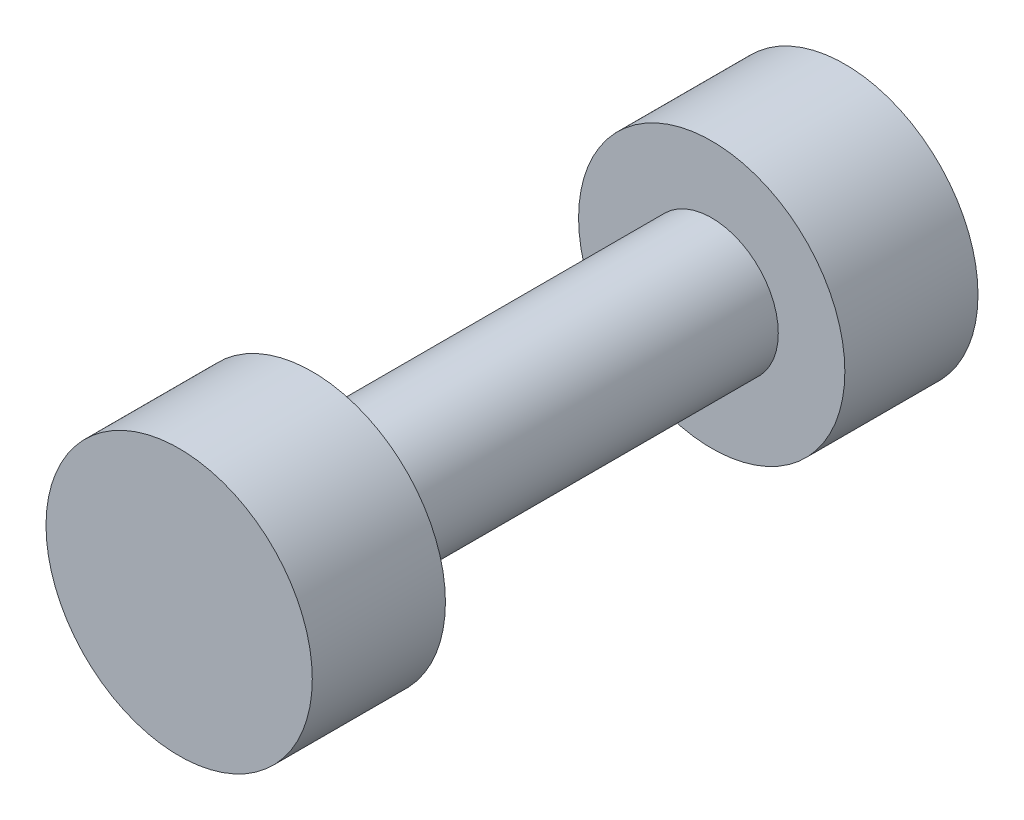
ISO-10303-21;
HEADER;
FILE_DESCRIPTION(('STEP AP214'),'2;1');
FILE_NAME('part.step','',(''),(''),'','','');
FILE_SCHEMA(('AUTOMOTIVE_DESIGN { 1 0 10303 214 1 1 1 1 }'));
ENDSEC;
DATA;
#1=APPLICATION_CONTEXT('core data for automotive mechanical design processes');
#2=APPLICATION_PROTOCOL_DEFINITION('international standard','automotive_design',2000,#1);
#3=PRODUCT_CONTEXT('',#1,'mechanical');
#4=PRODUCT('Part','Part','',(#3));
#5=PRODUCT_RELATED_PRODUCT_CATEGORY('part','',(#4));
#6=PRODUCT_DEFINITION_FORMATION('','',#4);
#7=PRODUCT_DEFINITION_CONTEXT('part definition',#1,'design');
#8=PRODUCT_DEFINITION('design','',#6,#7);
#9=PRODUCT_DEFINITION_SHAPE('','',#8);
#10=(LENGTH_UNIT() NAMED_UNIT(*) SI_UNIT(.MILLI.,.METRE.));
#11=(NAMED_UNIT(*) PLANE_ANGLE_UNIT() SI_UNIT($,.RADIAN.));
#12=(NAMED_UNIT(*) SI_UNIT($,.STERADIAN.) SOLID_ANGLE_UNIT());
#13=UNCERTAINTY_MEASURE_WITH_UNIT(LENGTH_MEASURE(1.E-05),#10,'distance_accuracy_value','');
#14=(GEOMETRIC_REPRESENTATION_CONTEXT(3) GLOBAL_UNCERTAINTY_ASSIGNED_CONTEXT((#13)) GLOBAL_UNIT_ASSIGNED_CONTEXT((#10,
#11,#12)) REPRESENTATION_CONTEXT('',''));
#15=CARTESIAN_POINT('',(0.,0.,0.));
#16=DIRECTION('',(0.,0.,1.));
#17=DIRECTION('',(1.,0.,0.));
#18=AXIS2_PLACEMENT_3D('',#15,#16,#17);
#19=CARTESIAN_POINT('',(0.,0.,1.5));
#20=DIRECTION('',(0.,0.,-1.));
#21=DIRECTION('',(-1.,0.,0.));
#22=AXIS2_PLACEMENT_3D('',#19,#20,#21);
#23=CYLINDRICAL_SURFACE('',#22,0.5);
#24=CARTESIAN_POINT('',(0.,0.,1.5));
#25=DIRECTION('',(0.,0.,1.));
#26=DIRECTION('',(1.,0.,0.));
#27=AXIS2_PLACEMENT_3D('',#24,#25,#26);
#28=CIRCLE('',#27,0.5);
#29=CARTESIAN_POINT('',(0.5,0.,1.5));
#30=VERTEX_POINT('',#29);
#31=EDGE_CURVE('E10',#30,#30,#28,.T.);
#32=ORIENTED_EDGE('',*,*,#31,.F.);
#33=EDGE_LOOP('',(#32));
#34=FACE_BOUND('',#33,.T.);
#35=CARTESIAN_POINT('',(0.,0.,-1.5));
#36=DIRECTION('',(0.,0.,1.));
#37=DIRECTION('',(1.,0.,0.));
#38=AXIS2_PLACEMENT_3D('',#35,#36,#37);
#39=CIRCLE('',#38,0.5);
#40=CARTESIAN_POINT('',(0.5,0.,-1.5));
#41=VERTEX_POINT('',#40);
#42=EDGE_CURVE('E42',#41,#41,#39,.T.);
#43=ORIENTED_EDGE('',*,*,#42,.T.);
#44=EDGE_LOOP('',(#43));
#45=FACE_BOUND('',#44,.T.);
#46=ADVANCED_FACE('F39',(#34,#45),#23,.T.);
#47=CARTESIAN_POINT('',(0.,0.,2.5));
#48=DIRECTION('',(0.,0.,-1.));
#49=DIRECTION('',(-1.,0.,0.));
#50=AXIS2_PLACEMENT_3D('',#47,#48,#49);
#51=CYLINDRICAL_SURFACE('',#50,1.);
#52=CARTESIAN_POINT('',(0.,0.,2.5));
#53=DIRECTION('',(0.,0.,1.));
#54=DIRECTION('',(1.,0.,0.));
#55=AXIS2_PLACEMENT_3D('',#52,#53,#54);
#56=CIRCLE('',#55,1.);
#57=CARTESIAN_POINT('',(1.,0.,2.5));
#58=VERTEX_POINT('',#57);
#59=EDGE_CURVE('E46',#58,#58,#56,.T.);
#60=ORIENTED_EDGE('',*,*,#59,.F.);
#61=EDGE_LOOP('',(#60));
#62=FACE_BOUND('',#61,.T.);
#63=CARTESIAN_POINT('',(0.,0.,1.5));
#64=DIRECTION('',(0.,0.,1.));
#65=DIRECTION('',(1.,0.,0.));
#66=AXIS2_PLACEMENT_3D('',#63,#64,#65);
#67=CIRCLE('',#66,1.);
#68=CARTESIAN_POINT('',(1.,0.,1.5));
#69=VERTEX_POINT('',#68);
#70=EDGE_CURVE('E50',#69,#69,#67,.T.);
#71=ORIENTED_EDGE('',*,*,#70,.T.);
#72=EDGE_LOOP('',(#71));
#73=FACE_BOUND('',#72,.T.);
#74=ADVANCED_FACE('F87',(#62,#73),#51,.T.);
#75=CARTESIAN_POINT('',(0.,0.,2.5));
#76=DIRECTION('',(0.,0.,1.));
#77=DIRECTION('',(1.,0.,0.));
#78=AXIS2_PLACEMENT_3D('',#75,#76,#77);
#79=PLANE('',#78);
#80=ORIENTED_EDGE('',*,*,#59,.T.);
#81=EDGE_LOOP('',(#80));
#82=FACE_BOUND('',#81,.T.);
#83=ADVANCED_FACE('F83',(#82),#79,.T.);
#84=CARTESIAN_POINT('',(0.,0.,1.5));
#85=DIRECTION('',(0.,0.,1.));
#86=DIRECTION('',(1.,0.,0.));
#87=AXIS2_PLACEMENT_3D('',#84,#85,#86);
#88=PLANE('',#87);
#89=ORIENTED_EDGE('',*,*,#31,.T.);
#90=EDGE_LOOP('',(#89));
#91=FACE_BOUND('',#90,.T.);
#92=ORIENTED_EDGE('',*,*,#70,.F.);
#93=EDGE_LOOP('',(#92));
#94=FACE_BOUND('',#93,.T.);
#95=ADVANCED_FACE('F75',(#91,#94),#88,.F.);
#96=CARTESIAN_POINT('',(0.,0.,-2.5));
#97=DIRECTION('',(0.,0.,1.));
#98=DIRECTION('',(1.,0.,0.));
#99=AXIS2_PLACEMENT_3D('',#96,#97,#98);
#100=CYLINDRICAL_SURFACE('',#99,1.);
#101=CARTESIAN_POINT('',(0.,0.,-2.5));
#102=DIRECTION('',(0.,0.,1.));
#103=DIRECTION('',(1.,0.,0.));
#104=AXIS2_PLACEMENT_3D('',#101,#102,#103);
#105=CIRCLE('',#104,1.);
#106=CARTESIAN_POINT('',(1.,0.,-2.5));
#107=VERTEX_POINT('',#106);
#108=EDGE_CURVE('E58',#107,#107,#105,.T.);
#109=ORIENTED_EDGE('',*,*,#108,.T.);
#110=EDGE_LOOP('',(#109));
#111=FACE_BOUND('',#110,.T.);
#112=CARTESIAN_POINT('',(0.,0.,-1.5));
#113=DIRECTION('',(0.,0.,1.));
#114=DIRECTION('',(1.,0.,0.));
#115=AXIS2_PLACEMENT_3D('',#112,#113,#114);
#116=CIRCLE('',#115,1.);
#117=CARTESIAN_POINT('',(1.,0.,-1.5));
#118=VERTEX_POINT('',#117);
#119=EDGE_CURVE('E55',#118,#118,#116,.T.);
#120=ORIENTED_EDGE('',*,*,#119,.F.);
#121=EDGE_LOOP('',(#120));
#122=FACE_BOUND('',#121,.T.);
#123=ADVANCED_FACE('F73',(#111,#122),#100,.T.);
#124=CARTESIAN_POINT('',(0.,0.,-2.5));
#125=DIRECTION('',(0.,0.,-1.));
#126=DIRECTION('',(1.,0.,0.));
#127=AXIS2_PLACEMENT_3D('',#124,#125,#126);
#128=PLANE('',#127);
#129=ORIENTED_EDGE('',*,*,#108,.F.);
#130=EDGE_LOOP('',(#129));
#131=FACE_BOUND('',#130,.T.);
#132=ADVANCED_FACE('F69',(#131),#128,.T.);
#133=CARTESIAN_POINT('',(0.,0.,-1.5));
#134=DIRECTION('',(0.,0.,-1.));
#135=DIRECTION('',(1.,0.,0.));
#136=AXIS2_PLACEMENT_3D('',#133,#134,#135);
#137=PLANE('',#136);
#138=ORIENTED_EDGE('',*,*,#42,.F.);
#139=EDGE_LOOP('',(#138));
#140=FACE_BOUND('',#139,.T.);
#141=ORIENTED_EDGE('',*,*,#119,.T.);
#142=EDGE_LOOP('',(#141));
#143=FACE_BOUND('',#142,.T.);
#144=ADVANCED_FACE('F66',(#140,#143),#137,.F.);
#145=CLOSED_SHELL('',(#46,#74,#83,#95,#123,#132,#144));
#146=MANIFOLD_SOLID_BREP('B2',#145);
#147=ADVANCED_BREP_SHAPE_REPRESENTATION('',(#18,#146),#14);
#148=SHAPE_DEFINITION_REPRESENTATION(#9,#147);
ENDSEC;
END-ISO-10303-21;
